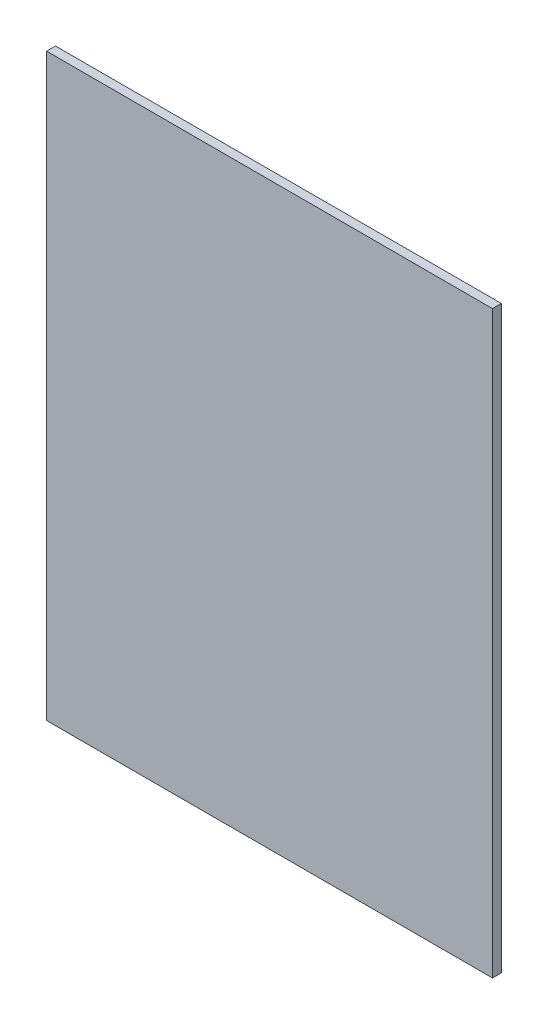
ISO-10303-21;
HEADER;
FILE_DESCRIPTION(('STEP AP214'),'2;1');
FILE_NAME('part.step','',(''),(''),'','','');
FILE_SCHEMA(('AUTOMOTIVE_DESIGN { 1 0 10303 214 1 1 1 1 }'));
ENDSEC;
DATA;
#1=APPLICATION_CONTEXT('core data for automotive mechanical design processes');
#2=APPLICATION_PROTOCOL_DEFINITION('international standard','automotive_design',2000,#1);
#3=PRODUCT_CONTEXT('',#1,'mechanical');
#4=PRODUCT('Part','Part','',(#3));
#5=PRODUCT_RELATED_PRODUCT_CATEGORY('part','',(#4));
#6=PRODUCT_DEFINITION_FORMATION('','',#4);
#7=PRODUCT_DEFINITION_CONTEXT('part definition',#1,'design');
#8=PRODUCT_DEFINITION('design','',#6,#7);
#9=PRODUCT_DEFINITION_SHAPE('','',#8);
#10=(LENGTH_UNIT() NAMED_UNIT(*) SI_UNIT(.MILLI.,.METRE.));
#11=(NAMED_UNIT(*) PLANE_ANGLE_UNIT() SI_UNIT($,.RADIAN.));
#12=(NAMED_UNIT(*) SI_UNIT($,.STERADIAN.) SOLID_ANGLE_UNIT());
#13=UNCERTAINTY_MEASURE_WITH_UNIT(LENGTH_MEASURE(1.E-05),#10,'distance_accuracy_value','');
#14=(GEOMETRIC_REPRESENTATION_CONTEXT(3) GLOBAL_UNCERTAINTY_ASSIGNED_CONTEXT((#13)) GLOBAL_UNIT_ASSIGNED_CONTEXT((#10,
#11,#12)) REPRESENTATION_CONTEXT('',''));
#15=CARTESIAN_POINT('',(0.,0.,0.));
#16=DIRECTION('',(0.,0.,1.));
#17=DIRECTION('',(1.,0.,0.));
#18=AXIS2_PLACEMENT_3D('',#15,#16,#17);
#19=CARTESIAN_POINT('',(50.,-65.,1.));
#20=DIRECTION('',(-1.,0.,0.));
#21=DIRECTION('',(0.,0.,1.));
#22=AXIS2_PLACEMENT_3D('',#19,#20,#21);
#23=PLANE('',#22);
#24=DIRECTION('',(0.,1.,0.));
#25=VECTOR('',#24,1.);
#26=CARTESIAN_POINT('',(50.,-65.,-1.));
#27=LINE('',#26,#25);
#28=CARTESIAN_POINT('',(50.,-65.,-1.));
#29=VERTEX_POINT('',#28);
#30=CARTESIAN_POINT('',(50.,65.,-1.));
#31=VERTEX_POINT('',#30);
#32=EDGE_CURVE('E96',#29,#31,#27,.T.);
#33=ORIENTED_EDGE('',*,*,#32,.T.);
#34=DIRECTION('',(0.,0.,-1.));
#35=VECTOR('',#34,1.);
#36=CARTESIAN_POINT('',(50.,65.,1.));
#37=LINE('',#36,#35);
#38=CARTESIAN_POINT('',(50.,65.,1.));
#39=VERTEX_POINT('',#38);
#40=EDGE_CURVE('E11',#39,#31,#37,.T.);
#41=ORIENTED_EDGE('',*,*,#40,.F.);
#42=DIRECTION('',(0.,1.,0.));
#43=VECTOR('',#42,1.);
#44=CARTESIAN_POINT('',(50.,-65.,1.));
#45=LINE('',#44,#43);
#46=CARTESIAN_POINT('',(50.,-65.,1.));
#47=VERTEX_POINT('',#46);
#48=EDGE_CURVE('E84',#47,#39,#45,.T.);
#49=ORIENTED_EDGE('',*,*,#48,.F.);
#50=DIRECTION('',(0.,0.,-1.));
#51=VECTOR('',#50,1.);
#52=CARTESIAN_POINT('',(50.,-65.,1.));
#53=LINE('',#52,#51);
#54=EDGE_CURVE('E92',#47,#29,#53,.T.);
#55=ORIENTED_EDGE('',*,*,#54,.T.);
#56=EDGE_LOOP('',(#33,#41,#49,#55));
#57=FACE_BOUND('',#56,.T.);
#58=ADVANCED_FACE('F33',(#57),#23,.F.);
#59=CARTESIAN_POINT('',(-50.,65.,1.));
#60=DIRECTION('',(0.,-1.,0.));
#61=DIRECTION('',(0.,0.,-1.));
#62=AXIS2_PLACEMENT_3D('',#59,#60,#61);
#63=PLANE('',#62);
#64=DIRECTION('',(-1.,0.,0.));
#65=VECTOR('',#64,1.);
#66=CARTESIAN_POINT('',(-50.,65.,-1.));
#67=LINE('',#66,#65);
#68=CARTESIAN_POINT('',(-50.,65.,-1.));
#69=VERTEX_POINT('',#68);
#70=EDGE_CURVE('E88',#31,#69,#67,.T.);
#71=ORIENTED_EDGE('',*,*,#70,.T.);
#72=DIRECTION('',(0.,0.,-1.));
#73=VECTOR('',#72,1.);
#74=CARTESIAN_POINT('',(-50.,65.,1.));
#75=LINE('',#74,#73);
#76=CARTESIAN_POINT('',(-50.,65.,1.));
#77=VERTEX_POINT('',#76);
#78=EDGE_CURVE('E41',#77,#69,#75,.T.);
#79=ORIENTED_EDGE('',*,*,#78,.F.);
#80=DIRECTION('',(-1.,0.,0.));
#81=VECTOR('',#80,1.);
#82=CARTESIAN_POINT('',(-50.,65.,1.));
#83=LINE('',#82,#81);
#84=EDGE_CURVE('E79',#39,#77,#83,.T.);
#85=ORIENTED_EDGE('',*,*,#84,.F.);
#86=ORIENTED_EDGE('',*,*,#40,.T.);
#87=EDGE_LOOP('',(#71,#79,#85,#86));
#88=FACE_BOUND('',#87,.T.);
#89=ADVANCED_FACE('F87',(#88),#63,.F.);
#90=CARTESIAN_POINT('',(-50.,-65.,1.));
#91=DIRECTION('',(1.,0.,0.));
#92=DIRECTION('',(0.,0.,-1.));
#93=AXIS2_PLACEMENT_3D('',#90,#91,#92);
#94=PLANE('',#93);
#95=DIRECTION('',(0.,-1.,0.));
#96=VECTOR('',#95,1.);
#97=CARTESIAN_POINT('',(-50.,-65.,-1.));
#98=LINE('',#97,#96);
#99=CARTESIAN_POINT('',(-50.,-65.,-1.));
#100=VERTEX_POINT('',#99);
#101=EDGE_CURVE('E66',#69,#100,#98,.T.);
#102=ORIENTED_EDGE('',*,*,#101,.T.);
#103=DIRECTION('',(0.,0.,-1.));
#104=VECTOR('',#103,1.);
#105=CARTESIAN_POINT('',(-50.,-65.,1.));
#106=LINE('',#105,#104);
#107=CARTESIAN_POINT('',(-50.,-65.,1.));
#108=VERTEX_POINT('',#107);
#109=EDGE_CURVE('E89',#108,#100,#106,.T.);
#110=ORIENTED_EDGE('',*,*,#109,.F.);
#111=DIRECTION('',(0.,-1.,0.));
#112=VECTOR('',#111,1.);
#113=CARTESIAN_POINT('',(-50.,-65.,1.));
#114=LINE('',#113,#112);
#115=EDGE_CURVE('E82',#77,#108,#114,.T.);
#116=ORIENTED_EDGE('',*,*,#115,.F.);
#117=ORIENTED_EDGE('',*,*,#78,.T.);
#118=EDGE_LOOP('',(#102,#110,#116,#117));
#119=FACE_BOUND('',#118,.T.);
#120=ADVANCED_FACE('F90',(#119),#94,.F.);
#121=CARTESIAN_POINT('',(-50.,-65.,1.));
#122=DIRECTION('',(0.,1.,0.));
#123=DIRECTION('',(0.,0.,1.));
#124=AXIS2_PLACEMENT_3D('',#121,#122,#123);
#125=PLANE('',#124);
#126=DIRECTION('',(1.,0.,0.));
#127=VECTOR('',#126,1.);
#128=CARTESIAN_POINT('',(-50.,-65.,-1.));
#129=LINE('',#128,#127);
#130=EDGE_CURVE('E72',#100,#29,#129,.T.);
#131=ORIENTED_EDGE('',*,*,#130,.T.);
#132=ORIENTED_EDGE('',*,*,#54,.F.);
#133=DIRECTION('',(1.,0.,0.));
#134=VECTOR('',#133,1.);
#135=CARTESIAN_POINT('',(-50.,-65.,1.));
#136=LINE('',#135,#134);
#137=EDGE_CURVE('E49',#108,#47,#136,.T.);
#138=ORIENTED_EDGE('',*,*,#137,.F.);
#139=ORIENTED_EDGE('',*,*,#109,.T.);
#140=EDGE_LOOP('',(#131,#132,#138,#139));
#141=FACE_BOUND('',#140,.T.);
#142=ADVANCED_FACE('F103',(#141),#125,.F.);
#143=CARTESIAN_POINT('',(0.,0.,1.));
#144=DIRECTION('',(0.,0.,-1.));
#145=DIRECTION('',(-1.,0.,0.));
#146=AXIS2_PLACEMENT_3D('',#143,#144,#145);
#147=PLANE('',#146);
#148=ORIENTED_EDGE('',*,*,#48,.T.);
#149=ORIENTED_EDGE('',*,*,#84,.T.);
#150=ORIENTED_EDGE('',*,*,#115,.T.);
#151=ORIENTED_EDGE('',*,*,#137,.T.);
#152=EDGE_LOOP('',(#148,#149,#150,#151));
#153=FACE_BOUND('',#152,.T.);
#154=ADVANCED_FACE('F80',(#153),#147,.F.);
#155=CARTESIAN_POINT('',(0.,0.,-1.));
#156=DIRECTION('',(0.,0.,-1.));
#157=DIRECTION('',(-1.,0.,0.));
#158=AXIS2_PLACEMENT_3D('',#155,#156,#157);
#159=PLANE('',#158);
#160=ORIENTED_EDGE('',*,*,#32,.F.);
#161=ORIENTED_EDGE('',*,*,#130,.F.);
#162=ORIENTED_EDGE('',*,*,#101,.F.);
#163=ORIENTED_EDGE('',*,*,#70,.F.);
#164=EDGE_LOOP('',(#160,#161,#162,#163));
#165=FACE_BOUND('',#164,.T.);
#166=ADVANCED_FACE('F106',(#165),#159,.T.);
#167=CLOSED_SHELL('',(#58,#89,#120,#142,#154,#166));
#168=MANIFOLD_SOLID_BREP('B2',#167);
#169=ADVANCED_BREP_SHAPE_REPRESENTATION('',(#18,#168),#14);
#170=SHAPE_DEFINITION_REPRESENTATION(#9,#169);
ENDSEC;
END-ISO-10303-21;
